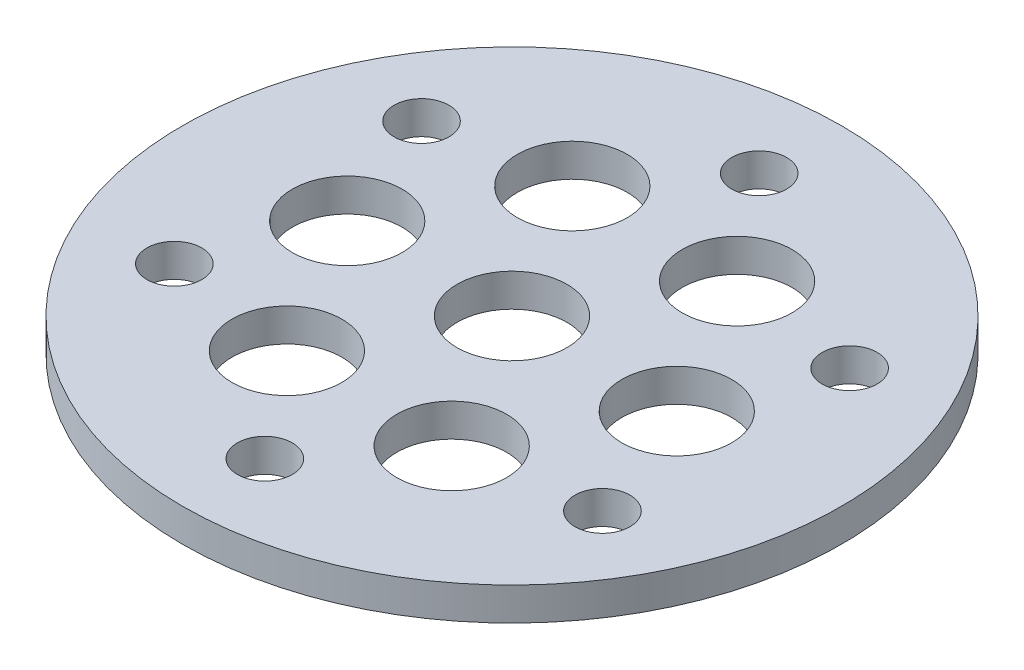
ISO-10303-21;
HEADER;
FILE_DESCRIPTION(('STEP AP214'),'2;1');
FILE_NAME('part.step','',(''),(''),'','','');
FILE_SCHEMA(('AUTOMOTIVE_DESIGN { 1 0 10303 214 1 1 1 1 }'));
ENDSEC;
DATA;
#1=APPLICATION_CONTEXT('core data for automotive mechanical design processes');
#2=APPLICATION_PROTOCOL_DEFINITION('international standard','automotive_design',2000,#1);
#3=PRODUCT_CONTEXT('',#1,'mechanical');
#4=PRODUCT('Part','Part','',(#3));
#5=PRODUCT_RELATED_PRODUCT_CATEGORY('part','',(#4));
#6=PRODUCT_DEFINITION_FORMATION('','',#4);
#7=PRODUCT_DEFINITION_CONTEXT('part definition',#1,'design');
#8=PRODUCT_DEFINITION('design','',#6,#7);
#9=PRODUCT_DEFINITION_SHAPE('','',#8);
#10=(LENGTH_UNIT() NAMED_UNIT(*) SI_UNIT(.MILLI.,.METRE.));
#11=(NAMED_UNIT(*) PLANE_ANGLE_UNIT() SI_UNIT($,.RADIAN.));
#12=(NAMED_UNIT(*) SI_UNIT($,.STERADIAN.) SOLID_ANGLE_UNIT());
#13=UNCERTAINTY_MEASURE_WITH_UNIT(LENGTH_MEASURE(1.E-05),#10,'distance_accuracy_value','');
#14=(GEOMETRIC_REPRESENTATION_CONTEXT(3) GLOBAL_UNCERTAINTY_ASSIGNED_CONTEXT((#13)) GLOBAL_UNIT_ASSIGNED_CONTEXT((#10,
#11,#12)) REPRESENTATION_CONTEXT('',''));
#15=CARTESIAN_POINT('',(0.,0.,0.));
#16=DIRECTION('',(0.,0.,1.));
#17=DIRECTION('',(1.,0.,0.));
#18=AXIS2_PLACEMENT_3D('',#15,#16,#17);
#19=CARTESIAN_POINT('',(0.,3.,0.));
#20=DIRECTION('',(0.,1.,0.));
#21=DIRECTION('',(0.,0.,1.));
#22=AXIS2_PLACEMENT_3D('',#19,#20,#21);
#23=PLANE('',#22);
#24=CARTESIAN_POINT('',(-7.5,3.,12.9903810567666));
#25=DIRECTION('',(0.,1.,0.));
#26=DIRECTION('',(0.,0.,1.));
#27=AXIS2_PLACEMENT_3D('',#24,#25,#26);
#28=CIRCLE('',#27,5.);
#29=CARTESIAN_POINT('',(-7.5,3.,17.9903810567666));
#30=VERTEX_POINT('',#29);
#31=EDGE_CURVE('E136',#30,#30,#28,.T.);
#32=ORIENTED_EDGE('',*,*,#31,.F.);
#33=EDGE_LOOP('',(#32));
#34=FACE_BOUND('',#33,.T.);
#35=CARTESIAN_POINT('',(15.,3.,0.));
#36=DIRECTION('',(0.,1.,0.));
#37=DIRECTION('',(0.,0.,1.));
#38=AXIS2_PLACEMENT_3D('',#35,#36,#37);
#39=CIRCLE('',#38,5.);
#40=CARTESIAN_POINT('',(15.,3.,5.));
#41=VERTEX_POINT('',#40);
#42=EDGE_CURVE('E120',#41,#41,#39,.T.);
#43=ORIENTED_EDGE('',*,*,#42,.F.);
#44=EDGE_LOOP('',(#43));
#45=FACE_BOUND('',#44,.T.);
#46=CARTESIAN_POINT('',(-19.4855715851499,3.,-11.25));
#47=DIRECTION('',(0.,1.,0.));
#48=DIRECTION('',(0.,0.,1.));
#49=AXIS2_PLACEMENT_3D('',#46,#47,#48);
#50=CIRCLE('',#49,2.5);
#51=CARTESIAN_POINT('',(-19.4855715851499,3.,-8.74999999999998));
#52=VERTEX_POINT('',#51);
#53=EDGE_CURVE('E104',#52,#52,#50,.T.);
#54=ORIENTED_EDGE('',*,*,#53,.F.);
#55=EDGE_LOOP('',(#54));
#56=FACE_BOUND('',#55,.T.);
#57=CARTESIAN_POINT('',(0.,3.,22.5));
#58=DIRECTION('',(0.,1.,0.));
#59=DIRECTION('',(0.,0.,1.));
#60=AXIS2_PLACEMENT_3D('',#57,#58,#59);
#61=CIRCLE('',#60,2.5);
#62=CARTESIAN_POINT('',(0.,3.,25.));
#63=VERTEX_POINT('',#62);
#64=EDGE_CURVE('E88',#63,#63,#61,.T.);
#65=ORIENTED_EDGE('',*,*,#64,.F.);
#66=EDGE_LOOP('',(#65));
#67=FACE_BOUND('',#66,.T.);
#68=CARTESIAN_POINT('',(19.4855715851499,3.,-11.25));
#69=DIRECTION('',(0.,1.,0.));
#70=DIRECTION('',(0.,0.,1.));
#71=AXIS2_PLACEMENT_3D('',#68,#69,#70);
#72=CIRCLE('',#71,2.5);
#73=CARTESIAN_POINT('',(19.4855715851499,3.,-8.75000000000001));
#74=VERTEX_POINT('',#73);
#75=EDGE_CURVE('E72',#74,#74,#72,.T.);
#76=ORIENTED_EDGE('',*,*,#75,.F.);
#77=EDGE_LOOP('',(#76));
#78=FACE_BOUND('',#77,.T.);
#79=CARTESIAN_POINT('',(0.,3.,-22.5));
#80=DIRECTION('',(0.,1.,0.));
#81=DIRECTION('',(0.,0.,1.));
#82=AXIS2_PLACEMENT_3D('',#79,#80,#81);
#83=CIRCLE('',#82,2.5);
#84=CARTESIAN_POINT('',(0.,3.,-20.));
#85=VERTEX_POINT('',#84);
#86=EDGE_CURVE('E56',#85,#85,#83,.T.);
#87=ORIENTED_EDGE('',*,*,#86,.F.);
#88=EDGE_LOOP('',(#87));
#89=FACE_BOUND('',#88,.T.);
#90=CARTESIAN_POINT('',(0.,3.,0.));
#91=DIRECTION('',(0.,1.,0.));
#92=DIRECTION('',(0.,0.,1.));
#93=AXIS2_PLACEMENT_3D('',#90,#91,#92);
#94=CIRCLE('',#93,30.);
#95=CARTESIAN_POINT('',(0.,3.,30.));
#96=VERTEX_POINT('',#95);
#97=EDGE_CURVE('E10',#96,#96,#94,.T.);
#98=ORIENTED_EDGE('',*,*,#97,.T.);
#99=EDGE_LOOP('',(#98));
#100=FACE_BOUND('',#99,.T.);
#101=CARTESIAN_POINT('',(0.,3.,0.));
#102=DIRECTION('',(0.,1.,0.));
#103=DIRECTION('',(0.,0.,1.));
#104=AXIS2_PLACEMENT_3D('',#101,#102,#103);
#105=CIRCLE('',#104,5.);
#106=CARTESIAN_POINT('',(0.,3.,5.));
#107=VERTEX_POINT('',#106);
#108=EDGE_CURVE('E50',#107,#107,#105,.T.);
#109=ORIENTED_EDGE('',*,*,#108,.F.);
#110=EDGE_LOOP('',(#109));
#111=FACE_BOUND('',#110,.T.);
#112=CARTESIAN_POINT('',(-7.5,3.,-12.9903810567666));
#113=DIRECTION('',(0.,1.,0.));
#114=DIRECTION('',(0.,0.,1.));
#115=AXIS2_PLACEMENT_3D('',#112,#113,#114);
#116=CIRCLE('',#115,5.);
#117=CARTESIAN_POINT('',(-7.5,3.,-7.99038105676658));
#118=VERTEX_POINT('',#117);
#119=EDGE_CURVE('E64',#118,#118,#116,.T.);
#120=ORIENTED_EDGE('',*,*,#119,.F.);
#121=EDGE_LOOP('',(#120));
#122=FACE_BOUND('',#121,.T.);
#123=CARTESIAN_POINT('',(19.4855715851499,3.,11.25));
#124=DIRECTION('',(0.,1.,0.));
#125=DIRECTION('',(0.,0.,1.));
#126=AXIS2_PLACEMENT_3D('',#123,#124,#125);
#127=CIRCLE('',#126,2.5);
#128=CARTESIAN_POINT('',(19.4855715851499,3.,13.75));
#129=VERTEX_POINT('',#128);
#130=EDGE_CURVE('E80',#129,#129,#127,.T.);
#131=ORIENTED_EDGE('',*,*,#130,.F.);
#132=EDGE_LOOP('',(#131));
#133=FACE_BOUND('',#132,.T.);
#134=CARTESIAN_POINT('',(-19.4855715851499,3.,11.25));
#135=DIRECTION('',(0.,1.,0.));
#136=DIRECTION('',(0.,0.,1.));
#137=AXIS2_PLACEMENT_3D('',#134,#135,#136);
#138=CIRCLE('',#137,2.5);
#139=CARTESIAN_POINT('',(-19.4855715851499,3.,13.75));
#140=VERTEX_POINT('',#139);
#141=EDGE_CURVE('E96',#140,#140,#138,.T.);
#142=ORIENTED_EDGE('',*,*,#141,.F.);
#143=EDGE_LOOP('',(#142));
#144=FACE_BOUND('',#143,.T.);
#145=CARTESIAN_POINT('',(7.5,3.,-12.9903810567666));
#146=DIRECTION('',(0.,1.,0.));
#147=DIRECTION('',(0.,0.,1.));
#148=AXIS2_PLACEMENT_3D('',#145,#146,#147);
#149=CIRCLE('',#148,5.);
#150=CARTESIAN_POINT('',(7.5,3.,-7.99038105676658));
#151=VERTEX_POINT('',#150);
#152=EDGE_CURVE('E112',#151,#151,#149,.T.);
#153=ORIENTED_EDGE('',*,*,#152,.F.);
#154=EDGE_LOOP('',(#153));
#155=FACE_BOUND('',#154,.T.);
#156=CARTESIAN_POINT('',(7.5,3.,12.9903810567666));
#157=DIRECTION('',(0.,1.,0.));
#158=DIRECTION('',(0.,0.,1.));
#159=AXIS2_PLACEMENT_3D('',#156,#157,#158);
#160=CIRCLE('',#159,5.);
#161=CARTESIAN_POINT('',(7.5,3.,17.9903810567666));
#162=VERTEX_POINT('',#161);
#163=EDGE_CURVE('E128',#162,#162,#160,.T.);
#164=ORIENTED_EDGE('',*,*,#163,.F.);
#165=EDGE_LOOP('',(#164));
#166=FACE_BOUND('',#165,.T.);
#167=CARTESIAN_POINT('',(-15.,3.,0.));
#168=DIRECTION('',(0.,1.,0.));
#169=DIRECTION('',(0.,0.,1.));
#170=AXIS2_PLACEMENT_3D('',#167,#168,#169);
#171=CIRCLE('',#170,5.);
#172=CARTESIAN_POINT('',(-15.,3.,5.00000000000001));
#173=VERTEX_POINT('',#172);
#174=EDGE_CURVE('E144',#173,#173,#171,.T.);
#175=ORIENTED_EDGE('',*,*,#174,.F.);
#176=EDGE_LOOP('',(#175));
#177=FACE_BOUND('',#176,.T.);
#178=ADVANCED_FACE('F37',(#34,#45,#56,#67,#78,#89,#100,#111,#122,#133,#144,#155,#166,#177),#23,.T.);
#179=CARTESIAN_POINT('',(0.,0.,0.));
#180=DIRECTION('',(0.,1.,0.));
#181=DIRECTION('',(0.,0.,1.));
#182=AXIS2_PLACEMENT_3D('',#179,#180,#181);
#183=PLANE('',#182);
#184=CARTESIAN_POINT('',(0.,0.,0.));
#185=DIRECTION('',(0.,1.,0.));
#186=DIRECTION('',(0.,0.,1.));
#187=AXIS2_PLACEMENT_3D('',#184,#185,#186);
#188=CIRCLE('',#187,30.);
#189=CARTESIAN_POINT('',(0.,0.,30.));
#190=VERTEX_POINT('',#189);
#191=EDGE_CURVE('E41',#190,#190,#188,.T.);
#192=ORIENTED_EDGE('',*,*,#191,.F.);
#193=EDGE_LOOP('',(#192));
#194=FACE_BOUND('',#193,.T.);
#195=CARTESIAN_POINT('',(0.,0.,0.));
#196=DIRECTION('',(0.,1.,0.));
#197=DIRECTION('',(0.,0.,1.));
#198=AXIS2_PLACEMENT_3D('',#195,#196,#197);
#199=CIRCLE('',#198,5.);
#200=CARTESIAN_POINT('',(0.,0.,5.));
#201=VERTEX_POINT('',#200);
#202=EDGE_CURVE('E52',#201,#201,#199,.T.);
#203=ORIENTED_EDGE('',*,*,#202,.T.);
#204=EDGE_LOOP('',(#203));
#205=FACE_BOUND('',#204,.T.);
#206=CARTESIAN_POINT('',(0.,0.,-22.5));
#207=DIRECTION('',(0.,1.,0.));
#208=DIRECTION('',(0.,0.,1.));
#209=AXIS2_PLACEMENT_3D('',#206,#207,#208);
#210=CIRCLE('',#209,2.5);
#211=CARTESIAN_POINT('',(0.,0.,-20.));
#212=VERTEX_POINT('',#211);
#213=EDGE_CURVE('E60',#212,#212,#210,.T.);
#214=ORIENTED_EDGE('',*,*,#213,.T.);
#215=EDGE_LOOP('',(#214));
#216=FACE_BOUND('',#215,.T.);
#217=CARTESIAN_POINT('',(-7.5,0.,-12.9903810567666));
#218=DIRECTION('',(0.,1.,0.));
#219=DIRECTION('',(0.,0.,1.));
#220=AXIS2_PLACEMENT_3D('',#217,#218,#219);
#221=CIRCLE('',#220,5.);
#222=CARTESIAN_POINT('',(-7.5,0.,-7.99038105676658));
#223=VERTEX_POINT('',#222);
#224=EDGE_CURVE('E68',#223,#223,#221,.T.);
#225=ORIENTED_EDGE('',*,*,#224,.T.);
#226=EDGE_LOOP('',(#225));
#227=FACE_BOUND('',#226,.T.);
#228=CARTESIAN_POINT('',(19.4855715851499,0.,-11.25));
#229=DIRECTION('',(0.,1.,0.));
#230=DIRECTION('',(0.,0.,1.));
#231=AXIS2_PLACEMENT_3D('',#228,#229,#230);
#232=CIRCLE('',#231,2.5);
#233=CARTESIAN_POINT('',(19.4855715851499,0.,-8.75000000000001));
#234=VERTEX_POINT('',#233);
#235=EDGE_CURVE('E76',#234,#234,#232,.T.);
#236=ORIENTED_EDGE('',*,*,#235,.T.);
#237=EDGE_LOOP('',(#236));
#238=FACE_BOUND('',#237,.T.);
#239=CARTESIAN_POINT('',(19.4855715851499,0.,11.25));
#240=DIRECTION('',(0.,1.,0.));
#241=DIRECTION('',(0.,0.,1.));
#242=AXIS2_PLACEMENT_3D('',#239,#240,#241);
#243=CIRCLE('',#242,2.5);
#244=CARTESIAN_POINT('',(19.4855715851499,0.,13.75));
#245=VERTEX_POINT('',#244);
#246=EDGE_CURVE('E84',#245,#245,#243,.T.);
#247=ORIENTED_EDGE('',*,*,#246,.T.);
#248=EDGE_LOOP('',(#247));
#249=FACE_BOUND('',#248,.T.);
#250=CARTESIAN_POINT('',(0.,0.,22.5));
#251=DIRECTION('',(0.,1.,0.));
#252=DIRECTION('',(0.,0.,1.));
#253=AXIS2_PLACEMENT_3D('',#250,#251,#252);
#254=CIRCLE('',#253,2.5);
#255=CARTESIAN_POINT('',(0.,0.,25.));
#256=VERTEX_POINT('',#255);
#257=EDGE_CURVE('E92',#256,#256,#254,.T.);
#258=ORIENTED_EDGE('',*,*,#257,.T.);
#259=EDGE_LOOP('',(#258));
#260=FACE_BOUND('',#259,.T.);
#261=CARTESIAN_POINT('',(-19.4855715851499,0.,11.25));
#262=DIRECTION('',(0.,1.,0.));
#263=DIRECTION('',(0.,0.,1.));
#264=AXIS2_PLACEMENT_3D('',#261,#262,#263);
#265=CIRCLE('',#264,2.5);
#266=CARTESIAN_POINT('',(-19.4855715851499,0.,13.75));
#267=VERTEX_POINT('',#266);
#268=EDGE_CURVE('E100',#267,#267,#265,.T.);
#269=ORIENTED_EDGE('',*,*,#268,.T.);
#270=EDGE_LOOP('',(#269));
#271=FACE_BOUND('',#270,.T.);
#272=CARTESIAN_POINT('',(-19.4855715851499,0.,-11.25));
#273=DIRECTION('',(0.,1.,0.));
#274=DIRECTION('',(0.,0.,1.));
#275=AXIS2_PLACEMENT_3D('',#272,#273,#274);
#276=CIRCLE('',#275,2.5);
#277=CARTESIAN_POINT('',(-19.4855715851499,0.,-8.74999999999998));
#278=VERTEX_POINT('',#277);
#279=EDGE_CURVE('E108',#278,#278,#276,.T.);
#280=ORIENTED_EDGE('',*,*,#279,.T.);
#281=EDGE_LOOP('',(#280));
#282=FACE_BOUND('',#281,.T.);
#283=CARTESIAN_POINT('',(7.5,0.,-12.9903810567666));
#284=DIRECTION('',(0.,1.,0.));
#285=DIRECTION('',(0.,0.,1.));
#286=AXIS2_PLACEMENT_3D('',#283,#284,#285);
#287=CIRCLE('',#286,5.);
#288=CARTESIAN_POINT('',(7.5,0.,-7.99038105676658));
#289=VERTEX_POINT('',#288);
#290=EDGE_CURVE('E116',#289,#289,#287,.T.);
#291=ORIENTED_EDGE('',*,*,#290,.T.);
#292=EDGE_LOOP('',(#291));
#293=FACE_BOUND('',#292,.T.);
#294=CARTESIAN_POINT('',(15.,0.,0.));
#295=DIRECTION('',(0.,1.,0.));
#296=DIRECTION('',(0.,0.,1.));
#297=AXIS2_PLACEMENT_3D('',#294,#295,#296);
#298=CIRCLE('',#297,5.);
#299=CARTESIAN_POINT('',(15.,0.,5.));
#300=VERTEX_POINT('',#299);
#301=EDGE_CURVE('E124',#300,#300,#298,.T.);
#302=ORIENTED_EDGE('',*,*,#301,.T.);
#303=EDGE_LOOP('',(#302));
#304=FACE_BOUND('',#303,.T.);
#305=CARTESIAN_POINT('',(7.5,0.,12.9903810567666));
#306=DIRECTION('',(0.,1.,0.));
#307=DIRECTION('',(0.,0.,1.));
#308=AXIS2_PLACEMENT_3D('',#305,#306,#307);
#309=CIRCLE('',#308,5.);
#310=CARTESIAN_POINT('',(7.5,0.,17.9903810567666));
#311=VERTEX_POINT('',#310);
#312=EDGE_CURVE('E132',#311,#311,#309,.T.);
#313=ORIENTED_EDGE('',*,*,#312,.T.);
#314=EDGE_LOOP('',(#313));
#315=FACE_BOUND('',#314,.T.);
#316=CARTESIAN_POINT('',(-7.5,0.,12.9903810567666));
#317=DIRECTION('',(0.,1.,0.));
#318=DIRECTION('',(0.,0.,1.));
#319=AXIS2_PLACEMENT_3D('',#316,#317,#318);
#320=CIRCLE('',#319,5.);
#321=CARTESIAN_POINT('',(-7.5,0.,17.9903810567666));
#322=VERTEX_POINT('',#321);
#323=EDGE_CURVE('E140',#322,#322,#320,.T.);
#324=ORIENTED_EDGE('',*,*,#323,.T.);
#325=EDGE_LOOP('',(#324));
#326=FACE_BOUND('',#325,.T.);
#327=CARTESIAN_POINT('',(-15.,0.,0.));
#328=DIRECTION('',(0.,1.,0.));
#329=DIRECTION('',(0.,0.,1.));
#330=AXIS2_PLACEMENT_3D('',#327,#328,#329);
#331=CIRCLE('',#330,5.);
#332=CARTESIAN_POINT('',(-15.,0.,5.00000000000001));
#333=VERTEX_POINT('',#332);
#334=EDGE_CURVE('E148',#333,#333,#331,.T.);
#335=ORIENTED_EDGE('',*,*,#334,.T.);
#336=EDGE_LOOP('',(#335));
#337=FACE_BOUND('',#336,.T.);
#338=ADVANCED_FACE('F160',(#194,#205,#216,#227,#238,#249,#260,#271,#282,#293,#304,#315,#326,
#337),#183,.F.);
#339=CARTESIAN_POINT('',(0.,3.,0.));
#340=DIRECTION('',(0.,-1.,0.));
#341=DIRECTION('',(0.,0.,-1.));
#342=AXIS2_PLACEMENT_3D('',#339,#340,#341);
#343=CYLINDRICAL_SURFACE('',#342,30.);
#344=ORIENTED_EDGE('',*,*,#97,.F.);
#345=EDGE_LOOP('',(#344));
#346=FACE_BOUND('',#345,.T.);
#347=ORIENTED_EDGE('',*,*,#191,.T.);
#348=EDGE_LOOP('',(#347));
#349=FACE_BOUND('',#348,.T.);
#350=ADVANCED_FACE('F39',(#346,#349),#343,.T.);
#351=CARTESIAN_POINT('',(0.,3.,0.));
#352=DIRECTION('',(0.,-1.,0.));
#353=DIRECTION('',(0.,0.,-1.));
#354=AXIS2_PLACEMENT_3D('',#351,#352,#353);
#355=CYLINDRICAL_SURFACE('',#354,5.);
#356=ORIENTED_EDGE('',*,*,#108,.T.);
#357=EDGE_LOOP('',(#356));
#358=FACE_BOUND('',#357,.T.);
#359=ORIENTED_EDGE('',*,*,#202,.F.);
#360=EDGE_LOOP('',(#359));
#361=FACE_BOUND('',#360,.T.);
#362=ADVANCED_FACE('F170',(#358,#361),#355,.F.);
#363=CARTESIAN_POINT('',(0.,3.,-22.5));
#364=DIRECTION('',(0.,-1.,0.));
#365=DIRECTION('',(0.,0.,-1.));
#366=AXIS2_PLACEMENT_3D('',#363,#364,#365);
#367=CYLINDRICAL_SURFACE('',#366,2.5);
#368=ORIENTED_EDGE('',*,*,#86,.T.);
#369=EDGE_LOOP('',(#368));
#370=FACE_BOUND('',#369,.T.);
#371=ORIENTED_EDGE('',*,*,#213,.F.);
#372=EDGE_LOOP('',(#371));
#373=FACE_BOUND('',#372,.T.);
#374=ADVANCED_FACE('F173',(#370,#373),#367,.F.);
#375=CARTESIAN_POINT('',(-7.5,3.,-12.9903810567666));
#376=DIRECTION('',(0.,-1.,0.));
#377=DIRECTION('',(0.,0.,-1.));
#378=AXIS2_PLACEMENT_3D('',#375,#376,#377);
#379=CYLINDRICAL_SURFACE('',#378,5.);
#380=ORIENTED_EDGE('',*,*,#119,.T.);
#381=EDGE_LOOP('',(#380));
#382=FACE_BOUND('',#381,.T.);
#383=ORIENTED_EDGE('',*,*,#224,.F.);
#384=EDGE_LOOP('',(#383));
#385=FACE_BOUND('',#384,.T.);
#386=ADVANCED_FACE('F177',(#382,#385),#379,.F.);
#387=CARTESIAN_POINT('',(19.4855715851499,3.,-11.25));
#388=DIRECTION('',(0.,-1.,0.));
#389=DIRECTION('',(0.,0.,-1.));
#390=AXIS2_PLACEMENT_3D('',#387,#388,#389);
#391=CYLINDRICAL_SURFACE('',#390,2.5);
#392=ORIENTED_EDGE('',*,*,#75,.T.);
#393=EDGE_LOOP('',(#392));
#394=FACE_BOUND('',#393,.T.);
#395=ORIENTED_EDGE('',*,*,#235,.F.);
#396=EDGE_LOOP('',(#395));
#397=FACE_BOUND('',#396,.T.);
#398=ADVANCED_FACE('F181',(#394,#397),#391,.F.);
#399=CARTESIAN_POINT('',(19.4855715851499,3.,11.25));
#400=DIRECTION('',(0.,-1.,0.));
#401=DIRECTION('',(0.,0.,-1.));
#402=AXIS2_PLACEMENT_3D('',#399,#400,#401);
#403=CYLINDRICAL_SURFACE('',#402,2.5);
#404=ORIENTED_EDGE('',*,*,#130,.T.);
#405=EDGE_LOOP('',(#404));
#406=FACE_BOUND('',#405,.T.);
#407=ORIENTED_EDGE('',*,*,#246,.F.);
#408=EDGE_LOOP('',(#407));
#409=FACE_BOUND('',#408,.T.);
#410=ADVANCED_FACE('F185',(#406,#409),#403,.F.);
#411=CARTESIAN_POINT('',(0.,3.,22.5));
#412=DIRECTION('',(0.,-1.,0.));
#413=DIRECTION('',(0.,0.,-1.));
#414=AXIS2_PLACEMENT_3D('',#411,#412,#413);
#415=CYLINDRICAL_SURFACE('',#414,2.5);
#416=ORIENTED_EDGE('',*,*,#64,.T.);
#417=EDGE_LOOP('',(#416));
#418=FACE_BOUND('',#417,.T.);
#419=ORIENTED_EDGE('',*,*,#257,.F.);
#420=EDGE_LOOP('',(#419));
#421=FACE_BOUND('',#420,.T.);
#422=ADVANCED_FACE('F189',(#418,#421),#415,.F.);
#423=CARTESIAN_POINT('',(-19.4855715851499,3.,11.25));
#424=DIRECTION('',(0.,-1.,0.));
#425=DIRECTION('',(0.,0.,-1.));
#426=AXIS2_PLACEMENT_3D('',#423,#424,#425);
#427=CYLINDRICAL_SURFACE('',#426,2.5);
#428=ORIENTED_EDGE('',*,*,#141,.T.);
#429=EDGE_LOOP('',(#428));
#430=FACE_BOUND('',#429,.T.);
#431=ORIENTED_EDGE('',*,*,#268,.F.);
#432=EDGE_LOOP('',(#431));
#433=FACE_BOUND('',#432,.T.);
#434=ADVANCED_FACE('F193',(#430,#433),#427,.F.);
#435=CARTESIAN_POINT('',(-19.4855715851499,3.,-11.25));
#436=DIRECTION('',(0.,-1.,0.));
#437=DIRECTION('',(0.,0.,-1.));
#438=AXIS2_PLACEMENT_3D('',#435,#436,#437);
#439=CYLINDRICAL_SURFACE('',#438,2.5);
#440=ORIENTED_EDGE('',*,*,#53,.T.);
#441=EDGE_LOOP('',(#440));
#442=FACE_BOUND('',#441,.T.);
#443=ORIENTED_EDGE('',*,*,#279,.F.);
#444=EDGE_LOOP('',(#443));
#445=FACE_BOUND('',#444,.T.);
#446=ADVANCED_FACE('F197',(#442,#445),#439,.F.);
#447=CARTESIAN_POINT('',(7.5,3.,-12.9903810567666));
#448=DIRECTION('',(0.,-1.,0.));
#449=DIRECTION('',(0.,0.,-1.));
#450=AXIS2_PLACEMENT_3D('',#447,#448,#449);
#451=CYLINDRICAL_SURFACE('',#450,5.);
#452=ORIENTED_EDGE('',*,*,#152,.T.);
#453=EDGE_LOOP('',(#452));
#454=FACE_BOUND('',#453,.T.);
#455=ORIENTED_EDGE('',*,*,#290,.F.);
#456=EDGE_LOOP('',(#455));
#457=FACE_BOUND('',#456,.T.);
#458=ADVANCED_FACE('F201',(#454,#457),#451,.F.);
#459=CARTESIAN_POINT('',(15.,3.,0.));
#460=DIRECTION('',(0.,-1.,0.));
#461=DIRECTION('',(0.,0.,-1.));
#462=AXIS2_PLACEMENT_3D('',#459,#460,#461);
#463=CYLINDRICAL_SURFACE('',#462,5.);
#464=ORIENTED_EDGE('',*,*,#42,.T.);
#465=EDGE_LOOP('',(#464));
#466=FACE_BOUND('',#465,.T.);
#467=ORIENTED_EDGE('',*,*,#301,.F.);
#468=EDGE_LOOP('',(#467));
#469=FACE_BOUND('',#468,.T.);
#470=ADVANCED_FACE('F205',(#466,#469),#463,.F.);
#471=CARTESIAN_POINT('',(7.5,3.,12.9903810567666));
#472=DIRECTION('',(0.,-1.,0.));
#473=DIRECTION('',(0.,0.,-1.));
#474=AXIS2_PLACEMENT_3D('',#471,#472,#473);
#475=CYLINDRICAL_SURFACE('',#474,5.);
#476=ORIENTED_EDGE('',*,*,#163,.T.);
#477=EDGE_LOOP('',(#476));
#478=FACE_BOUND('',#477,.T.);
#479=ORIENTED_EDGE('',*,*,#312,.F.);
#480=EDGE_LOOP('',(#479));
#481=FACE_BOUND('',#480,.T.);
#482=ADVANCED_FACE('F209',(#478,#481),#475,.F.);
#483=CARTESIAN_POINT('',(-7.5,3.,12.9903810567666));
#484=DIRECTION('',(0.,-1.,0.));
#485=DIRECTION('',(0.,0.,-1.));
#486=AXIS2_PLACEMENT_3D('',#483,#484,#485);
#487=CYLINDRICAL_SURFACE('',#486,5.);
#488=ORIENTED_EDGE('',*,*,#31,.T.);
#489=EDGE_LOOP('',(#488));
#490=FACE_BOUND('',#489,.T.);
#491=ORIENTED_EDGE('',*,*,#323,.F.);
#492=EDGE_LOOP('',(#491));
#493=FACE_BOUND('',#492,.T.);
#494=ADVANCED_FACE('F213',(#490,#493),#487,.F.);
#495=CARTESIAN_POINT('',(-15.,3.,0.));
#496=DIRECTION('',(0.,-1.,0.));
#497=DIRECTION('',(0.,0.,-1.));
#498=AXIS2_PLACEMENT_3D('',#495,#496,#497);
#499=CYLINDRICAL_SURFACE('',#498,5.);
#500=ORIENTED_EDGE('',*,*,#174,.T.);
#501=EDGE_LOOP('',(#500));
#502=FACE_BOUND('',#501,.T.);
#503=ORIENTED_EDGE('',*,*,#334,.F.);
#504=EDGE_LOOP('',(#503));
#505=FACE_BOUND('',#504,.T.);
#506=ADVANCED_FACE('F156',(#502,#505),#499,.F.);
#507=CLOSED_SHELL('',(#178,#338,#350,#362,#374,#386,#398,#410,#422,#434,#446,#458,#470,#482,
#494,#506));
#508=MANIFOLD_SOLID_BREP('B2',#507);
#509=ADVANCED_BREP_SHAPE_REPRESENTATION('',(#18,#508),#14);
#510=SHAPE_DEFINITION_REPRESENTATION(#9,#509);
ENDSEC;
END-ISO-10303-21;
